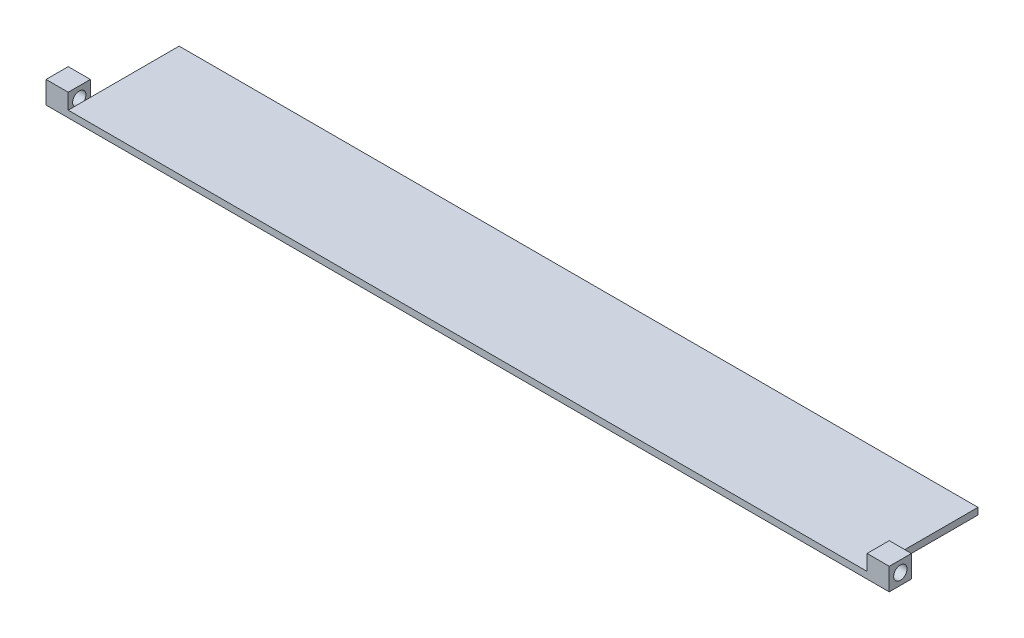
ISO-10303-21;
HEADER;
FILE_DESCRIPTION(('STEP AP214'),'2;1');
FILE_NAME('part.step','',(''),(''),'','','');
FILE_SCHEMA(('AUTOMOTIVE_DESIGN { 1 0 10303 214 1 1 1 1 }'));
ENDSEC;
DATA;
#1=APPLICATION_CONTEXT('core data for automotive mechanical design processes');
#2=APPLICATION_PROTOCOL_DEFINITION('international standard','automotive_design',2000,#1);
#3=PRODUCT_CONTEXT('',#1,'mechanical');
#4=PRODUCT('Part','Part','',(#3));
#5=PRODUCT_RELATED_PRODUCT_CATEGORY('part','',(#4));
#6=PRODUCT_DEFINITION_FORMATION('','',#4);
#7=PRODUCT_DEFINITION_CONTEXT('part definition',#1,'design');
#8=PRODUCT_DEFINITION('design','',#6,#7);
#9=PRODUCT_DEFINITION_SHAPE('','',#8);
#10=(LENGTH_UNIT() NAMED_UNIT(*) SI_UNIT(.MILLI.,.METRE.));
#11=(NAMED_UNIT(*) PLANE_ANGLE_UNIT() SI_UNIT($,.RADIAN.));
#12=(NAMED_UNIT(*) SI_UNIT($,.STERADIAN.) SOLID_ANGLE_UNIT());
#13=UNCERTAINTY_MEASURE_WITH_UNIT(LENGTH_MEASURE(1.E-05),#10,'distance_accuracy_value','');
#14=(GEOMETRIC_REPRESENTATION_CONTEXT(3) GLOBAL_UNCERTAINTY_ASSIGNED_CONTEXT((#13)) GLOBAL_UNIT_ASSIGNED_CONTEXT((#10,
#11,#12)) REPRESENTATION_CONTEXT('',''));
#15=CARTESIAN_POINT('',(0.,0.,0.));
#16=DIRECTION('',(0.,0.,1.));
#17=DIRECTION('',(1.,0.,0.));
#18=AXIS2_PLACEMENT_3D('',#15,#16,#17);
#19=CARTESIAN_POINT('',(-90.,1.5,12.5));
#20=DIRECTION('',(1.,0.,0.));
#21=DIRECTION('',(0.,0.,-1.));
#22=AXIS2_PLACEMENT_3D('',#19,#20,#21);
#23=PLANE('',#22);
#24=DIRECTION('',(0.,-1.,0.));
#25=VECTOR('',#24,1.);
#26=CARTESIAN_POINT('',(-90.,0.,7.5));
#27=LINE('',#26,#25);
#28=CARTESIAN_POINT('',(-90.,1.5,7.5));
#29=VERTEX_POINT('',#28);
#30=CARTESIAN_POINT('',(-90.,0.,7.5));
#31=VERTEX_POINT('',#30);
#32=EDGE_CURVE('E41',#29,#31,#27,.T.);
#33=ORIENTED_EDGE('',*,*,#32,.F.);
#34=DIRECTION('',(0.,0.,1.));
#35=VECTOR('',#34,1.);
#36=CARTESIAN_POINT('',(-90.,1.5,12.5));
#37=LINE('',#36,#35);
#38=CARTESIAN_POINT('',(-90.,1.5,-12.5));
#39=VERTEX_POINT('',#38);
#40=EDGE_CURVE('E146',#39,#29,#37,.T.);
#41=ORIENTED_EDGE('',*,*,#40,.F.);
#42=DIRECTION('',(0.,-1.,0.));
#43=VECTOR('',#42,1.);
#44=CARTESIAN_POINT('',(-90.,1.5,-12.5));
#45=LINE('',#44,#43);
#46=CARTESIAN_POINT('',(-90.,0.,-12.5));
#47=VERTEX_POINT('',#46);
#48=EDGE_CURVE('E155',#39,#47,#45,.T.);
#49=ORIENTED_EDGE('',*,*,#48,.T.);
#50=DIRECTION('',(0.,0.,1.));
#51=VECTOR('',#50,1.);
#52=CARTESIAN_POINT('',(-90.,0.,12.5));
#53=LINE('',#52,#51);
#54=EDGE_CURVE('E161',#47,#31,#53,.T.);
#55=ORIENTED_EDGE('',*,*,#54,.T.);
#56=EDGE_LOOP('',(#33,#41,#49,#55));
#57=FACE_BOUND('',#56,.T.);
#58=ADVANCED_FACE('F33',(#57),#23,.F.);
#59=CARTESIAN_POINT('',(90.,1.5,12.5));
#60=DIRECTION('',(-1.,0.,0.));
#61=DIRECTION('',(0.,0.,1.));
#62=AXIS2_PLACEMENT_3D('',#59,#60,#61);
#63=PLANE('',#62);
#64=DIRECTION('',(0.,1.,0.));
#65=VECTOR('',#64,1.);
#66=CARTESIAN_POINT('',(90.,0.,7.5));
#67=LINE('',#66,#65);
#68=CARTESIAN_POINT('',(90.,0.,7.5));
#69=VERTEX_POINT('',#68);
#70=CARTESIAN_POINT('',(90.,1.5,7.5));
#71=VERTEX_POINT('',#70);
#72=EDGE_CURVE('E239',#69,#71,#67,.T.);
#73=ORIENTED_EDGE('',*,*,#72,.F.);
#74=DIRECTION('',(0.,0.,-1.));
#75=VECTOR('',#74,1.);
#76=CARTESIAN_POINT('',(90.,0.,12.5));
#77=LINE('',#76,#75);
#78=CARTESIAN_POINT('',(90.,0.,-12.5));
#79=VERTEX_POINT('',#78);
#80=EDGE_CURVE('E156',#69,#79,#77,.T.);
#81=ORIENTED_EDGE('',*,*,#80,.T.);
#82=DIRECTION('',(0.,-1.,0.));
#83=VECTOR('',#82,1.);
#84=CARTESIAN_POINT('',(90.,1.5,-12.5));
#85=LINE('',#84,#83);
#86=CARTESIAN_POINT('',(90.,1.5,-12.5));
#87=VERTEX_POINT('',#86);
#88=EDGE_CURVE('E167',#87,#79,#85,.T.);
#89=ORIENTED_EDGE('',*,*,#88,.F.);
#90=DIRECTION('',(0.,0.,-1.));
#91=VECTOR('',#90,1.);
#92=CARTESIAN_POINT('',(90.,1.5,12.5));
#93=LINE('',#92,#91);
#94=EDGE_CURVE('E165',#71,#87,#93,.T.);
#95=ORIENTED_EDGE('',*,*,#94,.F.);
#96=EDGE_LOOP('',(#73,#81,#89,#95));
#97=FACE_BOUND('',#96,.T.);
#98=ADVANCED_FACE('F35',(#97),#63,.F.);
#99=CARTESIAN_POINT('',(-90.,1.5,-12.5));
#100=DIRECTION('',(0.,0.,1.));
#101=DIRECTION('',(1.,0.,0.));
#102=AXIS2_PLACEMENT_3D('',#99,#100,#101);
#103=PLANE('',#102);
#104=DIRECTION('',(-1.,0.,0.));
#105=VECTOR('',#104,1.);
#106=CARTESIAN_POINT('',(-90.,0.,-12.5));
#107=LINE('',#106,#105);
#108=EDGE_CURVE('E158',#79,#47,#107,.T.);
#109=ORIENTED_EDGE('',*,*,#108,.T.);
#110=ORIENTED_EDGE('',*,*,#48,.F.);
#111=DIRECTION('',(-1.,0.,0.));
#112=VECTOR('',#111,1.);
#113=CARTESIAN_POINT('',(-90.,1.5,-12.5));
#114=LINE('',#113,#112);
#115=EDGE_CURVE('E144',#87,#39,#114,.T.);
#116=ORIENTED_EDGE('',*,*,#115,.F.);
#117=ORIENTED_EDGE('',*,*,#88,.T.);
#118=EDGE_LOOP('',(#109,#110,#116,#117));
#119=FACE_BOUND('',#118,.T.);
#120=ADVANCED_FACE('F259',(#119),#103,.F.);
#121=CARTESIAN_POINT('',(-90.,1.5,12.5));
#122=DIRECTION('',(0.,0.,-1.));
#123=DIRECTION('',(-1.,0.,0.));
#124=AXIS2_PLACEMENT_3D('',#121,#122,#123);
#125=PLANE('',#124);
#126=DIRECTION('',(1.,0.,0.));
#127=VECTOR('',#126,1.);
#128=CARTESIAN_POINT('',(-90.,0.,12.5));
#129=LINE('',#128,#127);
#130=CARTESIAN_POINT('',(-95.,0.,12.5));
#131=VERTEX_POINT('',#130);
#132=CARTESIAN_POINT('',(95.,0.,12.5));
#133=VERTEX_POINT('',#132);
#134=EDGE_CURVE('E163',#131,#133,#129,.T.);
#135=ORIENTED_EDGE('',*,*,#134,.T.);
#136=DIRECTION('',(0.,-1.,0.));
#137=VECTOR('',#136,1.);
#138=CARTESIAN_POINT('',(95.,0.,12.5));
#139=LINE('',#138,#137);
#140=CARTESIAN_POINT('',(95.,5.,12.5));
#141=VERTEX_POINT('',#140);
#142=EDGE_CURVE('E225',#141,#133,#139,.T.);
#143=ORIENTED_EDGE('',*,*,#142,.F.);
#144=DIRECTION('',(-1.,0.,0.));
#145=VECTOR('',#144,1.);
#146=CARTESIAN_POINT('',(95.,5.,12.5));
#147=LINE('',#146,#145);
#148=CARTESIAN_POINT('',(90.,5.,12.5));
#149=VERTEX_POINT('',#148);
#150=EDGE_CURVE('E235',#141,#149,#147,.T.);
#151=ORIENTED_EDGE('',*,*,#150,.T.);
#152=DIRECTION('',(0.,-1.,0.));
#153=VECTOR('',#152,1.);
#154=CARTESIAN_POINT('',(90.,0.,12.5));
#155=LINE('',#154,#153);
#156=CARTESIAN_POINT('',(90.,1.5,12.5));
#157=VERTEX_POINT('',#156);
#158=EDGE_CURVE('E223',#149,#157,#155,.T.);
#159=ORIENTED_EDGE('',*,*,#158,.T.);
#160=DIRECTION('',(1.,0.,0.));
#161=VECTOR('',#160,1.);
#162=CARTESIAN_POINT('',(-90.,1.5,12.5));
#163=LINE('',#162,#161);
#164=CARTESIAN_POINT('',(-90.,1.5,12.5));
#165=VERTEX_POINT('',#164);
#166=EDGE_CURVE('E152',#165,#157,#163,.T.);
#167=ORIENTED_EDGE('',*,*,#166,.F.);
#168=DIRECTION('',(0.,1.,0.));
#169=VECTOR('',#168,1.);
#170=CARTESIAN_POINT('',(-90.,0.,12.5));
#171=LINE('',#170,#169);
#172=CARTESIAN_POINT('',(-90.,5.,12.5));
#173=VERTEX_POINT('',#172);
#174=EDGE_CURVE('E135',#165,#173,#171,.T.);
#175=ORIENTED_EDGE('',*,*,#174,.T.);
#176=DIRECTION('',(1.,0.,0.));
#177=VECTOR('',#176,1.);
#178=CARTESIAN_POINT('',(-95.,5.,12.5));
#179=LINE('',#178,#177);
#180=CARTESIAN_POINT('',(-95.,5.,12.5));
#181=VERTEX_POINT('',#180);
#182=EDGE_CURVE('E211',#181,#173,#179,.T.);
#183=ORIENTED_EDGE('',*,*,#182,.F.);
#184=DIRECTION('',(0.,1.,0.));
#185=VECTOR('',#184,1.);
#186=CARTESIAN_POINT('',(-95.,0.,12.5));
#187=LINE('',#186,#185);
#188=EDGE_CURVE('E180',#131,#181,#187,.T.);
#189=ORIENTED_EDGE('',*,*,#188,.F.);
#190=EDGE_LOOP('',(#135,#143,#151,#159,#167,#175,#183,#189));
#191=FACE_BOUND('',#190,.T.);
#192=ADVANCED_FACE('F212',(#191),#125,.F.);
#193=CARTESIAN_POINT('',(0.,1.5,0.));
#194=DIRECTION('',(0.,-1.,0.));
#195=DIRECTION('',(0.,0.,-1.));
#196=AXIS2_PLACEMENT_3D('',#193,#194,#195);
#197=PLANE('',#196);
#198=CARTESIAN_POINT('',(90.,1.5,11.1180339887499));
#199=VERTEX_POINT('',#198);
#200=EDGE_CURVE('E249',#157,#199,#93,.T.);
#201=ORIENTED_EDGE('',*,*,#200,.T.);
#202=CARTESIAN_POINT('',(90.,1.5,8.8819660112501));
#203=VERTEX_POINT('',#202);
#204=EDGE_CURVE('E250',#199,#203,#93,.T.);
#205=ORIENTED_EDGE('',*,*,#204,.T.);
#206=EDGE_CURVE('E251',#203,#71,#93,.T.);
#207=ORIENTED_EDGE('',*,*,#206,.T.);
#208=ORIENTED_EDGE('',*,*,#94,.T.);
#209=ORIENTED_EDGE('',*,*,#115,.T.);
#210=ORIENTED_EDGE('',*,*,#40,.T.);
#211=CARTESIAN_POINT('',(-90.,1.5,8.8819660112501));
#212=VERTEX_POINT('',#211);
#213=EDGE_CURVE('E149',#29,#212,#37,.T.);
#214=ORIENTED_EDGE('',*,*,#213,.T.);
#215=CARTESIAN_POINT('',(-90.,1.5,11.1180339887499));
#216=VERTEX_POINT('',#215);
#217=EDGE_CURVE('E134',#212,#216,#37,.T.);
#218=ORIENTED_EDGE('',*,*,#217,.T.);
#219=EDGE_CURVE('E139',#216,#165,#37,.T.);
#220=ORIENTED_EDGE('',*,*,#219,.T.);
#221=ORIENTED_EDGE('',*,*,#166,.T.);
#222=EDGE_LOOP('',(#201,#205,#207,#208,#209,#210,#214,#218,#220,#221));
#223=FACE_BOUND('',#222,.T.);
#224=ADVANCED_FACE('F148',(#223),#197,.F.);
#225=CARTESIAN_POINT('',(0.,0.,0.));
#226=DIRECTION('',(0.,-1.,0.));
#227=DIRECTION('',(0.,0.,-1.));
#228=AXIS2_PLACEMENT_3D('',#225,#226,#227);
#229=PLANE('',#228);
#230=ORIENTED_EDGE('',*,*,#80,.F.);
#231=DIRECTION('',(-1.,0.,0.));
#232=VECTOR('',#231,1.);
#233=CARTESIAN_POINT('',(95.,0.,7.5));
#234=LINE('',#233,#232);
#235=CARTESIAN_POINT('',(95.,0.,7.5));
#236=VERTEX_POINT('',#235);
#237=EDGE_CURVE('E159',#236,#69,#234,.T.);
#238=ORIENTED_EDGE('',*,*,#237,.F.);
#239=DIRECTION('',(0.,0.,-1.));
#240=VECTOR('',#239,1.);
#241=CARTESIAN_POINT('',(95.,0.,12.5));
#242=LINE('',#241,#240);
#243=EDGE_CURVE('E228',#133,#236,#242,.T.);
#244=ORIENTED_EDGE('',*,*,#243,.F.);
#245=ORIENTED_EDGE('',*,*,#134,.F.);
#246=DIRECTION('',(0.,0.,1.));
#247=VECTOR('',#246,1.);
#248=CARTESIAN_POINT('',(-95.,0.,12.5));
#249=LINE('',#248,#247);
#250=CARTESIAN_POINT('',(-95.,0.,7.5));
#251=VERTEX_POINT('',#250);
#252=EDGE_CURVE('E192',#251,#131,#249,.T.);
#253=ORIENTED_EDGE('',*,*,#252,.F.);
#254=DIRECTION('',(1.,0.,0.));
#255=VECTOR('',#254,1.);
#256=CARTESIAN_POINT('',(-95.,0.,7.5));
#257=LINE('',#256,#255);
#258=EDGE_CURVE('E195',#251,#31,#257,.T.);
#259=ORIENTED_EDGE('',*,*,#258,.T.);
#260=ORIENTED_EDGE('',*,*,#54,.F.);
#261=ORIENTED_EDGE('',*,*,#108,.F.);
#262=EDGE_LOOP('',(#230,#238,#244,#245,#253,#259,#260,#261));
#263=FACE_BOUND('',#262,.T.);
#264=ADVANCED_FACE('F265',(#263),#229,.T.);
#265=CARTESIAN_POINT('',(90.,0.,0.));
#266=DIRECTION('',(-1.,0.,0.));
#267=DIRECTION('',(0.,0.,1.));
#268=AXIS2_PLACEMENT_3D('',#265,#266,#267);
#269=PLANE('',#268);
#270=CARTESIAN_POINT('',(90.,2.5,10.));
#271=DIRECTION('',(1.,0.,0.));
#272=DIRECTION('',(0.,0.,-1.));
#273=AXIS2_PLACEMENT_3D('',#270,#271,#272);
#274=CIRCLE('',#273,1.5);
#275=EDGE_CURVE('E217',#203,#199,#274,.T.);
#276=ORIENTED_EDGE('',*,*,#275,.T.);
#277=ORIENTED_EDGE('',*,*,#200,.F.);
#278=ORIENTED_EDGE('',*,*,#158,.F.);
#279=DIRECTION('',(0.,0.,1.));
#280=VECTOR('',#279,1.);
#281=CARTESIAN_POINT('',(90.,5.,12.5));
#282=LINE('',#281,#280);
#283=CARTESIAN_POINT('',(90.,5.,7.5));
#284=VERTEX_POINT('',#283);
#285=EDGE_CURVE('E229',#284,#149,#282,.T.);
#286=ORIENTED_EDGE('',*,*,#285,.F.);
#287=EDGE_CURVE('E238',#71,#284,#67,.T.);
#288=ORIENTED_EDGE('',*,*,#287,.F.);
#289=ORIENTED_EDGE('',*,*,#206,.F.);
#290=EDGE_LOOP('',(#276,#277,#278,#286,#288,#289));
#291=FACE_BOUND('',#290,.T.);
#292=ADVANCED_FACE('F284',(#291),#269,.T.);
#293=CARTESIAN_POINT('',(95.,0.,7.5));
#294=DIRECTION('',(0.,0.,1.));
#295=DIRECTION('',(1.,0.,0.));
#296=AXIS2_PLACEMENT_3D('',#293,#294,#295);
#297=PLANE('',#296);
#298=ORIENTED_EDGE('',*,*,#72,.T.);
#299=ORIENTED_EDGE('',*,*,#287,.T.);
#300=DIRECTION('',(-1.,0.,0.));
#301=VECTOR('',#300,1.);
#302=CARTESIAN_POINT('',(95.,5.,7.5));
#303=LINE('',#302,#301);
#304=CARTESIAN_POINT('',(95.,5.,7.5));
#305=VERTEX_POINT('',#304);
#306=EDGE_CURVE('E245',#305,#284,#303,.T.);
#307=ORIENTED_EDGE('',*,*,#306,.F.);
#308=DIRECTION('',(0.,1.,0.));
#309=VECTOR('',#308,1.);
#310=CARTESIAN_POINT('',(95.,0.,7.5));
#311=LINE('',#310,#309);
#312=EDGE_CURVE('E231',#236,#305,#311,.T.);
#313=ORIENTED_EDGE('',*,*,#312,.F.);
#314=ORIENTED_EDGE('',*,*,#237,.T.);
#315=EDGE_LOOP('',(#298,#299,#307,#313,#314));
#316=FACE_BOUND('',#315,.T.);
#317=ADVANCED_FACE('F286',(#316),#297,.F.);
#318=CARTESIAN_POINT('',(95.,5.,12.5));
#319=DIRECTION('',(0.,-1.,0.));
#320=DIRECTION('',(0.,0.,-1.));
#321=AXIS2_PLACEMENT_3D('',#318,#319,#320);
#322=PLANE('',#321);
#323=ORIENTED_EDGE('',*,*,#285,.T.);
#324=ORIENTED_EDGE('',*,*,#150,.F.);
#325=DIRECTION('',(0.,0.,1.));
#326=VECTOR('',#325,1.);
#327=CARTESIAN_POINT('',(95.,5.,12.5));
#328=LINE('',#327,#326);
#329=EDGE_CURVE('E233',#305,#141,#328,.T.);
#330=ORIENTED_EDGE('',*,*,#329,.F.);
#331=ORIENTED_EDGE('',*,*,#306,.T.);
#332=EDGE_LOOP('',(#323,#324,#330,#331));
#333=FACE_BOUND('',#332,.T.);
#334=ADVANCED_FACE('F289',(#333),#322,.F.);
#335=CARTESIAN_POINT('',(95.,0.,0.));
#336=DIRECTION('',(-1.,0.,0.));
#337=DIRECTION('',(0.,0.,1.));
#338=AXIS2_PLACEMENT_3D('',#335,#336,#337);
#339=PLANE('',#338);
#340=CARTESIAN_POINT('',(95.,2.5,10.));
#341=DIRECTION('',(1.,0.,0.));
#342=DIRECTION('',(0.,0.,-1.));
#343=AXIS2_PLACEMENT_3D('',#340,#341,#342);
#344=CIRCLE('',#343,1.5);
#345=CARTESIAN_POINT('',(95.,2.5,8.5));
#346=VERTEX_POINT('',#345);
#347=EDGE_CURVE('E213',#346,#346,#344,.T.);
#348=ORIENTED_EDGE('',*,*,#347,.F.);
#349=EDGE_LOOP('',(#348));
#350=FACE_BOUND('',#349,.T.);
#351=ORIENTED_EDGE('',*,*,#142,.T.);
#352=ORIENTED_EDGE('',*,*,#243,.T.);
#353=ORIENTED_EDGE('',*,*,#312,.T.);
#354=ORIENTED_EDGE('',*,*,#329,.T.);
#355=EDGE_LOOP('',(#351,#352,#353,#354));
#356=FACE_BOUND('',#355,.T.);
#357=ADVANCED_FACE('F293',(#350,#356),#339,.F.);
#358=CARTESIAN_POINT('',(90.,2.5,10.));
#359=DIRECTION('',(1.,0.,0.));
#360=DIRECTION('',(0.,0.,-1.));
#361=AXIS2_PLACEMENT_3D('',#358,#359,#360);
#362=PLANE('',#361);
#363=ORIENTED_EDGE('',*,*,#204,.F.);
#364=EDGE_CURVE('E221',#199,#203,#274,.T.);
#365=ORIENTED_EDGE('',*,*,#364,.T.);
#366=EDGE_LOOP('',(#363,#365));
#367=FACE_BOUND('',#366,.T.);
#368=ADVANCED_FACE('F300',(#367),#362,.T.);
#369=CARTESIAN_POINT('',(90.,2.5,10.));
#370=DIRECTION('',(1.,0.,0.));
#371=DIRECTION('',(0.,0.,-1.));
#372=AXIS2_PLACEMENT_3D('',#369,#370,#371);
#373=CYLINDRICAL_SURFACE('',#372,1.5);
#374=ORIENTED_EDGE('',*,*,#364,.F.);
#375=ORIENTED_EDGE('',*,*,#275,.F.);
#376=EDGE_LOOP('',(#374,#375));
#377=FACE_BOUND('',#376,.T.);
#378=ORIENTED_EDGE('',*,*,#347,.T.);
#379=EDGE_LOOP('',(#378));
#380=FACE_BOUND('',#379,.T.);
#381=ADVANCED_FACE('F302',(#377,#380),#373,.F.);
#382=CARTESIAN_POINT('',(-95.,5.,12.5));
#383=DIRECTION('',(0.,-1.,0.));
#384=DIRECTION('',(0.,0.,-1.));
#385=AXIS2_PLACEMENT_3D('',#382,#383,#384);
#386=PLANE('',#385);
#387=DIRECTION('',(0.,0.,-1.));
#388=VECTOR('',#387,1.);
#389=CARTESIAN_POINT('',(-90.,5.,12.5));
#390=LINE('',#389,#388);
#391=CARTESIAN_POINT('',(-90.,5.,7.5));
#392=VERTEX_POINT('',#391);
#393=EDGE_CURVE('E181',#173,#392,#390,.T.);
#394=ORIENTED_EDGE('',*,*,#393,.T.);
#395=DIRECTION('',(1.,0.,0.));
#396=VECTOR('',#395,1.);
#397=CARTESIAN_POINT('',(-95.,5.,7.5));
#398=LINE('',#397,#396);
#399=CARTESIAN_POINT('',(-95.,5.,7.5));
#400=VERTEX_POINT('',#399);
#401=EDGE_CURVE('E214',#400,#392,#398,.T.);
#402=ORIENTED_EDGE('',*,*,#401,.F.);
#403=DIRECTION('',(0.,0.,-1.));
#404=VECTOR('',#403,1.);
#405=CARTESIAN_POINT('',(-95.,5.,12.5));
#406=LINE('',#405,#404);
#407=EDGE_CURVE('E185',#181,#400,#406,.T.);
#408=ORIENTED_EDGE('',*,*,#407,.F.);
#409=ORIENTED_EDGE('',*,*,#182,.T.);
#410=EDGE_LOOP('',(#394,#402,#408,#409));
#411=FACE_BOUND('',#410,.T.);
#412=ADVANCED_FACE('F305',(#411),#386,.F.);
#413=CARTESIAN_POINT('',(-95.,0.,7.5));
#414=DIRECTION('',(0.,0.,1.));
#415=DIRECTION('',(1.,0.,0.));
#416=AXIS2_PLACEMENT_3D('',#413,#414,#415);
#417=PLANE('',#416);
#418=EDGE_CURVE('E173',#392,#29,#27,.T.);
#419=ORIENTED_EDGE('',*,*,#418,.T.);
#420=ORIENTED_EDGE('',*,*,#32,.T.);
#421=ORIENTED_EDGE('',*,*,#258,.F.);
#422=DIRECTION('',(0.,-1.,0.));
#423=VECTOR('',#422,1.);
#424=CARTESIAN_POINT('',(-95.,0.,7.5));
#425=LINE('',#424,#423);
#426=EDGE_CURVE('E196',#400,#251,#425,.T.);
#427=ORIENTED_EDGE('',*,*,#426,.F.);
#428=ORIENTED_EDGE('',*,*,#401,.T.);
#429=EDGE_LOOP('',(#419,#420,#421,#427,#428));
#430=FACE_BOUND('',#429,.T.);
#431=ADVANCED_FACE('F205',(#430),#417,.F.);
#432=CARTESIAN_POINT('',(-95.,0.,0.));
#433=DIRECTION('',(-1.,0.,0.));
#434=DIRECTION('',(0.,0.,1.));
#435=AXIS2_PLACEMENT_3D('',#432,#433,#434);
#436=PLANE('',#435);
#437=CARTESIAN_POINT('',(-95.,2.5,10.));
#438=DIRECTION('',(-1.,0.,0.));
#439=DIRECTION('',(0.,0.,1.));
#440=AXIS2_PLACEMENT_3D('',#437,#438,#439);
#441=CIRCLE('',#440,1.5);
#442=CARTESIAN_POINT('',(-95.,2.5,11.5));
#443=VERTEX_POINT('',#442);
#444=EDGE_CURVE('E136',#443,#443,#441,.T.);
#445=ORIENTED_EDGE('',*,*,#444,.F.);
#446=EDGE_LOOP('',(#445));
#447=FACE_BOUND('',#446,.T.);
#448=ORIENTED_EDGE('',*,*,#188,.T.);
#449=ORIENTED_EDGE('',*,*,#407,.T.);
#450=ORIENTED_EDGE('',*,*,#426,.T.);
#451=ORIENTED_EDGE('',*,*,#252,.T.);
#452=EDGE_LOOP('',(#448,#449,#450,#451));
#453=FACE_BOUND('',#452,.T.);
#454=ADVANCED_FACE('F202',(#447,#453),#436,.T.);
#455=CARTESIAN_POINT('',(-90.,0.,0.));
#456=DIRECTION('',(-1.,0.,0.));
#457=DIRECTION('',(0.,0.,1.));
#458=AXIS2_PLACEMENT_3D('',#455,#456,#457);
#459=PLANE('',#458);
#460=ORIENTED_EDGE('',*,*,#219,.F.);
#461=CARTESIAN_POINT('',(-90.,2.5,10.));
#462=DIRECTION('',(-1.,0.,0.));
#463=DIRECTION('',(0.,0.,1.));
#464=AXIS2_PLACEMENT_3D('',#461,#462,#463);
#465=CIRCLE('',#464,1.5);
#466=EDGE_CURVE('E11',#216,#212,#465,.T.);
#467=ORIENTED_EDGE('',*,*,#466,.T.);
#468=ORIENTED_EDGE('',*,*,#213,.F.);
#469=ORIENTED_EDGE('',*,*,#418,.F.);
#470=ORIENTED_EDGE('',*,*,#393,.F.);
#471=ORIENTED_EDGE('',*,*,#174,.F.);
#472=EDGE_LOOP('',(#460,#467,#468,#469,#470,#471));
#473=FACE_BOUND('',#472,.T.);
#474=ADVANCED_FACE('F140',(#473),#459,.F.);
#475=CARTESIAN_POINT('',(-90.,2.5,10.));
#476=DIRECTION('',(-1.,0.,0.));
#477=DIRECTION('',(0.,0.,1.));
#478=AXIS2_PLACEMENT_3D('',#475,#476,#477);
#479=PLANE('',#478);
#480=ORIENTED_EDGE('',*,*,#217,.F.);
#481=CARTESIAN_POINT('',(-90.,2.5,10.));
#482=DIRECTION('',(-1.,0.,0.));
#483=DIRECTION('',(0.,0.,1.));
#484=AXIS2_PLACEMENT_3D('',#481,#482,#483);
#485=CIRCLE('',#484,1.5);
#486=EDGE_CURVE('E47',#212,#216,#485,.T.);
#487=ORIENTED_EDGE('',*,*,#486,.T.);
#488=EDGE_LOOP('',(#480,#487));
#489=FACE_BOUND('',#488,.T.);
#490=ADVANCED_FACE('F132',(#489),#479,.T.);
#491=CARTESIAN_POINT('',(-90.,2.5,10.));
#492=DIRECTION('',(-1.,0.,0.));
#493=DIRECTION('',(0.,0.,1.));
#494=AXIS2_PLACEMENT_3D('',#491,#492,#493);
#495=CYLINDRICAL_SURFACE('',#494,1.5);
#496=ORIENTED_EDGE('',*,*,#486,.F.);
#497=ORIENTED_EDGE('',*,*,#466,.F.);
#498=EDGE_LOOP('',(#496,#497));
#499=FACE_BOUND('',#498,.T.);
#500=ORIENTED_EDGE('',*,*,#444,.T.);
#501=EDGE_LOOP('',(#500));
#502=FACE_BOUND('',#501,.T.);
#503=ADVANCED_FACE('F125',(#499,#502),#495,.F.);
#504=CLOSED_SHELL('',(#58,#98,#120,#192,#224,#264,#292,#317,#334,#357,#368,#381,#412,#431,#454,
#474,#490,#503));
#505=MANIFOLD_SOLID_BREP('B2',#504);
#506=ADVANCED_BREP_SHAPE_REPRESENTATION('',(#18,#505),#14);
#507=SHAPE_DEFINITION_REPRESENTATION(#9,#506);
ENDSEC;
END-ISO-10303-21;
